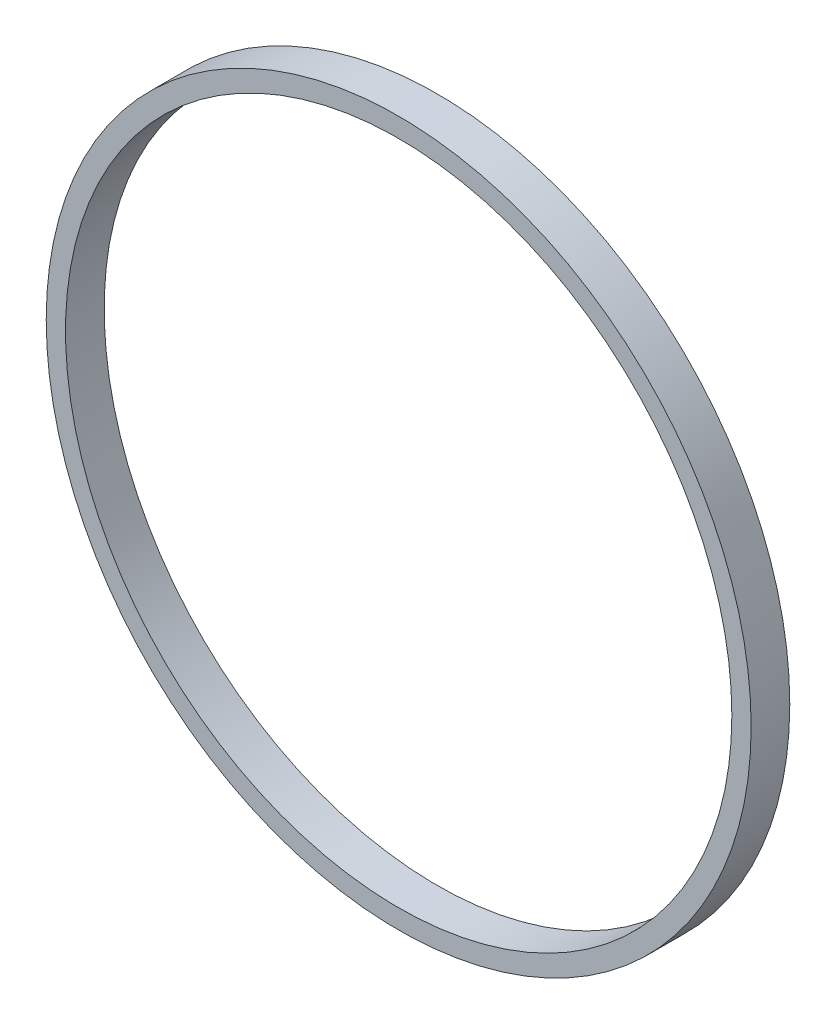
ISO-10303-21;
HEADER;
FILE_DESCRIPTION(('STEP AP214'),'2;1');
FILE_NAME('part.step','',(''),(''),'','','');
FILE_SCHEMA(('AUTOMOTIVE_DESIGN { 1 0 10303 214 1 1 1 1 }'));
ENDSEC;
DATA;
#1=APPLICATION_CONTEXT('core data for automotive mechanical design processes');
#2=APPLICATION_PROTOCOL_DEFINITION('international standard','automotive_design',2000,#1);
#3=PRODUCT_CONTEXT('',#1,'mechanical');
#4=PRODUCT('Part','Part','',(#3));
#5=PRODUCT_RELATED_PRODUCT_CATEGORY('part','',(#4));
#6=PRODUCT_DEFINITION_FORMATION('','',#4);
#7=PRODUCT_DEFINITION_CONTEXT('part definition',#1,'design');
#8=PRODUCT_DEFINITION('design','',#6,#7);
#9=PRODUCT_DEFINITION_SHAPE('','',#8);
#10=(LENGTH_UNIT() NAMED_UNIT(*) SI_UNIT(.MILLI.,.METRE.));
#11=(NAMED_UNIT(*) PLANE_ANGLE_UNIT() SI_UNIT($,.RADIAN.));
#12=(NAMED_UNIT(*) SI_UNIT($,.STERADIAN.) SOLID_ANGLE_UNIT());
#13=UNCERTAINTY_MEASURE_WITH_UNIT(LENGTH_MEASURE(1.E-05),#10,'distance_accuracy_value','');
#14=(GEOMETRIC_REPRESENTATION_CONTEXT(3) GLOBAL_UNCERTAINTY_ASSIGNED_CONTEXT((#13)) GLOBAL_UNIT_ASSIGNED_CONTEXT((#10,
#11,#12)) REPRESENTATION_CONTEXT('',''));
#15=CARTESIAN_POINT('',(0.,0.,0.));
#16=DIRECTION('',(0.,0.,1.));
#17=DIRECTION('',(1.,0.,0.));
#18=AXIS2_PLACEMENT_3D('',#15,#16,#17);
#19=CARTESIAN_POINT('',(0.,0.,5.08));
#20=DIRECTION('',(0.,0.,1.));
#21=DIRECTION('',(1.,0.,0.));
#22=AXIS2_PLACEMENT_3D('',#19,#20,#21);
#23=PLANE('',#22);
#24=CARTESIAN_POINT('',(0.,0.,5.08));
#25=DIRECTION('',(0.,0.,1.));
#26=DIRECTION('',(1.,0.,0.));
#27=AXIS2_PLACEMENT_3D('',#24,#25,#26);
#28=CIRCLE('',#27,46.355);
#29=CARTESIAN_POINT('',(46.355,0.,5.08));
#30=VERTEX_POINT('',#29);
#31=EDGE_CURVE('E10',#30,#30,#28,.T.);
#32=ORIENTED_EDGE('',*,*,#31,.T.);
#33=EDGE_LOOP('',(#32));
#34=FACE_BOUND('',#33,.T.);
#35=CARTESIAN_POINT('',(0.,0.,5.08));
#36=DIRECTION('',(0.,0.,1.));
#37=DIRECTION('',(1.,0.,0.));
#38=AXIS2_PLACEMENT_3D('',#35,#36,#37);
#39=CIRCLE('',#38,43.815);
#40=CARTESIAN_POINT('',(43.815,0.,5.08));
#41=VERTEX_POINT('',#40);
#42=EDGE_CURVE('E42',#41,#41,#39,.T.);
#43=ORIENTED_EDGE('',*,*,#42,.F.);
#44=EDGE_LOOP('',(#43));
#45=FACE_BOUND('',#44,.T.);
#46=ADVANCED_FACE('F31',(#34,#45),#23,.T.);
#47=CARTESIAN_POINT('',(0.,0.,0.));
#48=DIRECTION('',(0.,0.,1.));
#49=DIRECTION('',(1.,0.,0.));
#50=AXIS2_PLACEMENT_3D('',#47,#48,#49);
#51=PLANE('',#50);
#52=CARTESIAN_POINT('',(0.,0.,0.));
#53=DIRECTION('',(0.,0.,1.));
#54=DIRECTION('',(1.,0.,0.));
#55=AXIS2_PLACEMENT_3D('',#52,#53,#54);
#56=CIRCLE('',#55,46.355);
#57=CARTESIAN_POINT('',(46.355,0.,0.));
#58=VERTEX_POINT('',#57);
#59=EDGE_CURVE('E35',#58,#58,#56,.T.);
#60=ORIENTED_EDGE('',*,*,#59,.F.);
#61=EDGE_LOOP('',(#60));
#62=FACE_BOUND('',#61,.T.);
#63=CARTESIAN_POINT('',(0.,0.,0.));
#64=DIRECTION('',(0.,0.,1.));
#65=DIRECTION('',(1.,0.,0.));
#66=AXIS2_PLACEMENT_3D('',#63,#64,#65);
#67=CIRCLE('',#66,43.815);
#68=CARTESIAN_POINT('',(43.815,0.,0.));
#69=VERTEX_POINT('',#68);
#70=EDGE_CURVE('E44',#69,#69,#67,.T.);
#71=ORIENTED_EDGE('',*,*,#70,.T.);
#72=EDGE_LOOP('',(#71));
#73=FACE_BOUND('',#72,.T.);
#74=ADVANCED_FACE('F54',(#62,#73),#51,.F.);
#75=CARTESIAN_POINT('',(0.,0.,5.08));
#76=DIRECTION('',(0.,0.,-1.));
#77=DIRECTION('',(-1.,0.,0.));
#78=AXIS2_PLACEMENT_3D('',#75,#76,#77);
#79=CYLINDRICAL_SURFACE('',#78,46.355);
#80=ORIENTED_EDGE('',*,*,#31,.F.);
#81=EDGE_LOOP('',(#80));
#82=FACE_BOUND('',#81,.T.);
#83=ORIENTED_EDGE('',*,*,#59,.T.);
#84=EDGE_LOOP('',(#83));
#85=FACE_BOUND('',#84,.T.);
#86=ADVANCED_FACE('F33',(#82,#85),#79,.T.);
#87=CARTESIAN_POINT('',(0.,0.,5.08));
#88=DIRECTION('',(0.,0.,-1.));
#89=DIRECTION('',(-1.,0.,0.));
#90=AXIS2_PLACEMENT_3D('',#87,#88,#89);
#91=CYLINDRICAL_SURFACE('',#90,43.815);
#92=ORIENTED_EDGE('',*,*,#42,.T.);
#93=EDGE_LOOP('',(#92));
#94=FACE_BOUND('',#93,.T.);
#95=ORIENTED_EDGE('',*,*,#70,.F.);
#96=EDGE_LOOP('',(#95));
#97=FACE_BOUND('',#96,.T.);
#98=ADVANCED_FACE('F50',(#94,#97),#91,.F.);
#99=CLOSED_SHELL('',(#46,#74,#86,#98));
#100=MANIFOLD_SOLID_BREP('B2',#99);
#101=ADVANCED_BREP_SHAPE_REPRESENTATION('',(#18,#100),#14);
#102=SHAPE_DEFINITION_REPRESENTATION(#9,#101);
ENDSEC;
END-ISO-10303-21;
